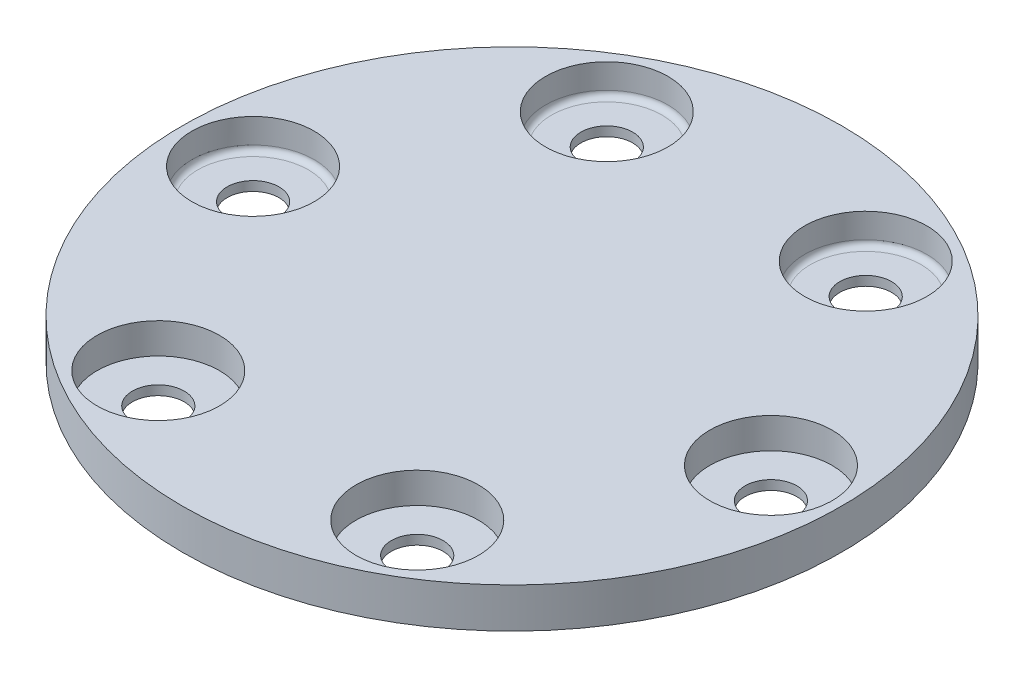
ISO-10303-21;
HEADER;
FILE_DESCRIPTION(('STEP AP214'),'2;1');
FILE_NAME('part.step','',(''),(''),'','','');
FILE_SCHEMA(('AUTOMOTIVE_DESIGN { 1 0 10303 214 1 1 1 1 }'));
ENDSEC;
DATA;
#1=APPLICATION_CONTEXT('core data for automotive mechanical design processes');
#2=APPLICATION_PROTOCOL_DEFINITION('international standard','automotive_design',2000,#1);
#3=PRODUCT_CONTEXT('',#1,'mechanical');
#4=PRODUCT('Part','Part','',(#3));
#5=PRODUCT_RELATED_PRODUCT_CATEGORY('part','',(#4));
#6=PRODUCT_DEFINITION_FORMATION('','',#4);
#7=PRODUCT_DEFINITION_CONTEXT('part definition',#1,'design');
#8=PRODUCT_DEFINITION('design','',#6,#7);
#9=PRODUCT_DEFINITION_SHAPE('','',#8);
#10=(LENGTH_UNIT() NAMED_UNIT(*) SI_UNIT(.MILLI.,.METRE.));
#11=(NAMED_UNIT(*) PLANE_ANGLE_UNIT() SI_UNIT($,.RADIAN.));
#12=(NAMED_UNIT(*) SI_UNIT($,.STERADIAN.) SOLID_ANGLE_UNIT());
#13=UNCERTAINTY_MEASURE_WITH_UNIT(LENGTH_MEASURE(1.E-05),#10,'distance_accuracy_value','');
#14=(GEOMETRIC_REPRESENTATION_CONTEXT(3) GLOBAL_UNCERTAINTY_ASSIGNED_CONTEXT((#13)) GLOBAL_UNIT_ASSIGNED_CONTEXT((#10,
#11,#12)) REPRESENTATION_CONTEXT('',''));
#15=CARTESIAN_POINT('',(0.,0.,0.));
#16=DIRECTION('',(0.,0.,1.));
#17=DIRECTION('',(1.,0.,0.));
#18=AXIS2_PLACEMENT_3D('',#15,#16,#17);
#19=CARTESIAN_POINT('',(0.,1.7,0.));
#20=DIRECTION('',(0.,-1.,0.));
#21=DIRECTION('',(0.,0.,-1.));
#22=AXIS2_PLACEMENT_3D('',#19,#20,#21);
#23=CYLINDRICAL_SURFACE('',#22,14.);
#24=CARTESIAN_POINT('',(0.,1.7,0.));
#25=DIRECTION('',(0.,1.,0.));
#26=DIRECTION('',(0.,0.,1.));
#27=AXIS2_PLACEMENT_3D('',#24,#25,#26);
#28=CIRCLE('',#27,14.);
#29=CARTESIAN_POINT('',(0.,1.7,14.));
#30=VERTEX_POINT('',#29);
#31=EDGE_CURVE('E59',#30,#30,#28,.T.);
#32=ORIENTED_EDGE('',*,*,#31,.F.);
#33=EDGE_LOOP('',(#32));
#34=FACE_BOUND('',#33,.T.);
#35=CARTESIAN_POINT('',(0.,0.,0.));
#36=DIRECTION('',(0.,1.,0.));
#37=DIRECTION('',(0.,0.,1.));
#38=AXIS2_PLACEMENT_3D('',#35,#36,#37);
#39=CIRCLE('',#38,14.);
#40=CARTESIAN_POINT('',(0.,0.,14.));
#41=VERTEX_POINT('',#40);
#42=EDGE_CURVE('E63',#41,#41,#39,.T.);
#43=ORIENTED_EDGE('',*,*,#42,.T.);
#44=EDGE_LOOP('',(#43));
#45=FACE_BOUND('',#44,.T.);
#46=ADVANCED_FACE('F33',(#34,#45),#23,.T.);
#47=CARTESIAN_POINT('',(0.,1.7,0.));
#48=DIRECTION('',(0.,1.,0.));
#49=DIRECTION('',(0.,0.,1.));
#50=AXIS2_PLACEMENT_3D('',#47,#48,#49);
#51=PLANE('',#50);
#52=CARTESIAN_POINT('',(-5.50000000000011,1.7,-9.52627944162876));
#53=DIRECTION('',(0.,1.,0.));
#54=DIRECTION('',(-0.866025403784433,0.,0.50000000000001));
#55=AXIS2_PLACEMENT_3D('',#52,#53,#54);
#56=CIRCLE('',#55,2.6);
#57=CARTESIAN_POINT('',(-7.75166604983964,1.7,-8.22627944162873));
#58=VERTEX_POINT('',#57);
#59=EDGE_CURVE('E94',#58,#58,#56,.T.);
#60=ORIENTED_EDGE('',*,*,#59,.F.);
#61=EDGE_LOOP('',(#60));
#62=FACE_BOUND('',#61,.T.);
#63=CARTESIAN_POINT('',(5.49999999999991,1.7,-9.52627944162887));
#64=DIRECTION('',(0.,1.,0.));
#65=DIRECTION('',(-0.866025403784443,0.,-0.499999999999992));
#66=AXIS2_PLACEMENT_3D('',#63,#64,#65);
#67=CIRCLE('',#66,2.6);
#68=CARTESIAN_POINT('',(3.24833395016036,1.7,-10.8262794416289));
#69=VERTEX_POINT('',#68);
#70=EDGE_CURVE('E90',#69,#69,#67,.T.);
#71=ORIENTED_EDGE('',*,*,#70,.F.);
#72=EDGE_LOOP('',(#71));
#73=FACE_BOUND('',#72,.T.);
#74=CARTESIAN_POINT('',(11.,1.7,0.));
#75=DIRECTION('',(0.,1.,0.));
#76=DIRECTION('',(0.,0.,-1.));
#77=AXIS2_PLACEMENT_3D('',#74,#75,#76);
#78=CIRCLE('',#77,2.6);
#79=CARTESIAN_POINT('',(11.,1.7,-2.6));
#80=VERTEX_POINT('',#79);
#81=EDGE_CURVE('E100',#80,#80,#78,.T.);
#82=ORIENTED_EDGE('',*,*,#81,.F.);
#83=EDGE_LOOP('',(#82));
#84=FACE_BOUND('',#83,.T.);
#85=CARTESIAN_POINT('',(5.50000000000004,1.7,9.5262794416288));
#86=DIRECTION('',(0.,1.,0.));
#87=DIRECTION('',(0.866025403784436,0.,-0.500000000000004));
#88=AXIS2_PLACEMENT_3D('',#85,#86,#87);
#89=CIRCLE('',#88,2.6);
#90=CARTESIAN_POINT('',(7.75166604983958,1.7,8.22627944162879));
#91=VERTEX_POINT('',#90);
#92=EDGE_CURVE('E109',#91,#91,#89,.T.);
#93=ORIENTED_EDGE('',*,*,#92,.F.);
#94=EDGE_LOOP('',(#93));
#95=FACE_BOUND('',#94,.T.);
#96=CARTESIAN_POINT('',(-5.49999999999998,1.7,9.52627944162884));
#97=DIRECTION('',(0.,1.,0.));
#98=DIRECTION('',(0.86602540378444,0.,0.499999999999998));
#99=AXIS2_PLACEMENT_3D('',#96,#97,#98);
#100=CIRCLE('',#99,2.6);
#101=CARTESIAN_POINT('',(-3.24833395016043,1.7,10.8262794416288));
#102=VERTEX_POINT('',#101);
#103=EDGE_CURVE('E83',#102,#102,#100,.T.);
#104=ORIENTED_EDGE('',*,*,#103,.F.);
#105=EDGE_LOOP('',(#104));
#106=FACE_BOUND('',#105,.T.);
#107=CARTESIAN_POINT('',(-11.,1.7,0.));
#108=DIRECTION('',(0.,1.,0.));
#109=DIRECTION('',(0.,0.,1.));
#110=AXIS2_PLACEMENT_3D('',#107,#108,#109);
#111=CIRCLE('',#110,2.6);
#112=CARTESIAN_POINT('',(-11.,1.7,2.6));
#113=VERTEX_POINT('',#112);
#114=EDGE_CURVE('E71',#113,#113,#111,.T.);
#115=ORIENTED_EDGE('',*,*,#114,.F.);
#116=EDGE_LOOP('',(#115));
#117=FACE_BOUND('',#116,.T.);
#118=ORIENTED_EDGE('',*,*,#31,.T.);
#119=EDGE_LOOP('',(#118));
#120=FACE_BOUND('',#119,.T.);
#121=ADVANCED_FACE('F131',(#62,#73,#84,#95,#106,#117,#120),#51,.T.);
#122=CARTESIAN_POINT('',(0.,0.,0.));
#123=DIRECTION('',(0.,1.,0.));
#124=DIRECTION('',(0.,0.,1.));
#125=AXIS2_PLACEMENT_3D('',#122,#123,#124);
#126=PLANE('',#125);
#127=CARTESIAN_POINT('',(-5.50000000000011,0.,-9.52627944162876));
#128=DIRECTION('',(0.,1.,0.));
#129=DIRECTION('',(-0.866025403784433,0.,0.50000000000001));
#130=AXIS2_PLACEMENT_3D('',#127,#128,#129);
#131=CIRCLE('',#130,1.1);
#132=CARTESIAN_POINT('',(-6.45262794416299,0.,-8.97627944162875));
#133=VERTEX_POINT('',#132);
#134=EDGE_CURVE('E91',#133,#133,#131,.T.);
#135=ORIENTED_EDGE('',*,*,#134,.T.);
#136=EDGE_LOOP('',(#135));
#137=FACE_BOUND('',#136,.T.);
#138=CARTESIAN_POINT('',(5.49999999999991,0.,-9.52627944162887));
#139=DIRECTION('',(0.,1.,0.));
#140=DIRECTION('',(-0.866025403784443,0.,-0.499999999999992));
#141=AXIS2_PLACEMENT_3D('',#138,#139,#140);
#142=CIRCLE('',#141,1.1);
#143=CARTESIAN_POINT('',(4.54737205583702,0.,-10.0762794416289));
#144=VERTEX_POINT('',#143);
#145=EDGE_CURVE('E101',#144,#144,#142,.T.);
#146=ORIENTED_EDGE('',*,*,#145,.T.);
#147=EDGE_LOOP('',(#146));
#148=FACE_BOUND('',#147,.T.);
#149=CARTESIAN_POINT('',(11.,0.,0.));
#150=DIRECTION('',(0.,1.,0.));
#151=DIRECTION('',(0.,0.,-1.));
#152=AXIS2_PLACEMENT_3D('',#149,#150,#151);
#153=CIRCLE('',#152,1.1);
#154=CARTESIAN_POINT('',(11.,0.,-1.1));
#155=VERTEX_POINT('',#154);
#156=EDGE_CURVE('E113',#155,#155,#153,.T.);
#157=ORIENTED_EDGE('',*,*,#156,.T.);
#158=EDGE_LOOP('',(#157));
#159=FACE_BOUND('',#158,.T.);
#160=CARTESIAN_POINT('',(5.50000000000004,0.,9.5262794416288));
#161=DIRECTION('',(0.,1.,0.));
#162=DIRECTION('',(0.866025403784436,0.,-0.500000000000004));
#163=AXIS2_PLACEMENT_3D('',#160,#161,#162);
#164=CIRCLE('',#163,1.1);
#165=CARTESIAN_POINT('',(6.45262794416292,0.,8.9762794416288));
#166=VERTEX_POINT('',#165);
#167=EDGE_CURVE('E123',#166,#166,#164,.T.);
#168=ORIENTED_EDGE('',*,*,#167,.T.);
#169=EDGE_LOOP('',(#168));
#170=FACE_BOUND('',#169,.T.);
#171=CARTESIAN_POINT('',(-5.49999999999998,0.,9.52627944162884));
#172=DIRECTION('',(0.,1.,0.));
#173=DIRECTION('',(0.86602540378444,0.,0.499999999999998));
#174=AXIS2_PLACEMENT_3D('',#171,#172,#173);
#175=CIRCLE('',#174,1.1);
#176=CARTESIAN_POINT('',(-4.5473720558371,0.,10.0762794416288));
#177=VERTEX_POINT('',#176);
#178=EDGE_CURVE('E80',#177,#177,#175,.T.);
#179=ORIENTED_EDGE('',*,*,#178,.T.);
#180=EDGE_LOOP('',(#179));
#181=FACE_BOUND('',#180,.T.);
#182=CARTESIAN_POINT('',(-11.,0.,0.));
#183=DIRECTION('',(0.,1.,0.));
#184=DIRECTION('',(0.,0.,1.));
#185=AXIS2_PLACEMENT_3D('',#182,#183,#184);
#186=CIRCLE('',#185,1.1);
#187=CARTESIAN_POINT('',(-11.,0.,1.1));
#188=VERTEX_POINT('',#187);
#189=EDGE_CURVE('E60',#188,#188,#186,.T.);
#190=ORIENTED_EDGE('',*,*,#189,.T.);
#191=EDGE_LOOP('',(#190));
#192=FACE_BOUND('',#191,.T.);
#193=ORIENTED_EDGE('',*,*,#42,.F.);
#194=EDGE_LOOP('',(#193));
#195=FACE_BOUND('',#194,.T.);
#196=ADVANCED_FACE('F134',(#137,#148,#159,#170,#181,#192,#195),#126,.F.);
#197=CARTESIAN_POINT('',(-11.,1.7,0.));
#198=DIRECTION('',(0.,1.,0.));
#199=DIRECTION('',(0.,0.,1.));
#200=AXIS2_PLACEMENT_3D('',#197,#198,#199);
#201=CYLINDRICAL_SURFACE('',#200,1.1);
#202=CARTESIAN_POINT('',(-11.,0.4,0.));
#203=DIRECTION('',(0.,1.,0.));
#204=DIRECTION('',(0.,0.,1.));
#205=AXIS2_PLACEMENT_3D('',#202,#203,#204);
#206=CIRCLE('',#205,1.1);
#207=CARTESIAN_POINT('',(-11.,0.4,1.1));
#208=VERTEX_POINT('',#207);
#209=EDGE_CURVE('E64',#208,#208,#206,.T.);
#210=ORIENTED_EDGE('',*,*,#209,.T.);
#211=EDGE_LOOP('',(#210));
#212=FACE_BOUND('',#211,.T.);
#213=ORIENTED_EDGE('',*,*,#189,.F.);
#214=EDGE_LOOP('',(#213));
#215=FACE_BOUND('',#214,.T.);
#216=ADVANCED_FACE('F149',(#212,#215),#201,.F.);
#217=CARTESIAN_POINT('',(-9.9,0.4,0.));
#218=DIRECTION('',(0.,-1.,0.));
#219=DIRECTION('',(0.,0.,-1.));
#220=AXIS2_PLACEMENT_3D('',#217,#218,#219);
#221=PLANE('',#220);
#222=CARTESIAN_POINT('',(-11.,0.4,0.));
#223=DIRECTION('',(0.,-1.,0.));
#224=DIRECTION('',(0.,0.,-1.));
#225=AXIS2_PLACEMENT_3D('',#222,#223,#224);
#226=CIRCLE('',#225,2.35);
#227=CARTESIAN_POINT('',(-11.,0.4,-2.35));
#228=VERTEX_POINT('',#227);
#229=EDGE_CURVE('E56',#228,#228,#226,.F.);
#230=ORIENTED_EDGE('',*,*,#229,.T.);
#231=EDGE_LOOP('',(#230));
#232=FACE_BOUND('',#231,.T.);
#233=ORIENTED_EDGE('',*,*,#209,.F.);
#234=EDGE_LOOP('',(#233));
#235=FACE_BOUND('',#234,.T.);
#236=ADVANCED_FACE('F155',(#232,#235),#221,.F.);
#237=CARTESIAN_POINT('',(-11.,1.7,0.));
#238=DIRECTION('',(0.,1.,0.));
#239=DIRECTION('',(0.,0.,1.));
#240=AXIS2_PLACEMENT_3D('',#237,#238,#239);
#241=CYLINDRICAL_SURFACE('',#240,2.6);
#242=CARTESIAN_POINT('',(-11.,0.65,0.));
#243=DIRECTION('',(0.,-1.,0.));
#244=DIRECTION('',(0.,0.,-1.));
#245=AXIS2_PLACEMENT_3D('',#242,#243,#244);
#246=CIRCLE('',#245,2.6);
#247=CARTESIAN_POINT('',(-11.,0.65,-2.6));
#248=VERTEX_POINT('',#247);
#249=EDGE_CURVE('E53',#248,#248,#246,.T.);
#250=ORIENTED_EDGE('',*,*,#249,.T.);
#251=EDGE_LOOP('',(#250));
#252=FACE_BOUND('',#251,.T.);
#253=ORIENTED_EDGE('',*,*,#114,.T.);
#254=EDGE_LOOP('',(#253));
#255=FACE_BOUND('',#254,.T.);
#256=ADVANCED_FACE('F201',(#252,#255),#241,.F.);
#257=CARTESIAN_POINT('',(-5.49999999999998,1.7,9.52627944162884));
#258=DIRECTION('',(0.,1.,0.));
#259=DIRECTION('',(0.86602540378444,0.,0.499999999999998));
#260=AXIS2_PLACEMENT_3D('',#257,#258,#259);
#261=CYLINDRICAL_SURFACE('',#260,1.1);
#262=CARTESIAN_POINT('',(-5.49999999999998,0.4,9.52627944162884));
#263=DIRECTION('',(0.,1.,0.));
#264=DIRECTION('',(0.86602540378444,0.,0.499999999999998));
#265=AXIS2_PLACEMENT_3D('',#262,#263,#264);
#266=CIRCLE('',#265,1.1);
#267=CARTESIAN_POINT('',(-4.5473720558371,0.4,10.0762794416288));
#268=VERTEX_POINT('',#267);
#269=EDGE_CURVE('E74',#268,#268,#266,.T.);
#270=ORIENTED_EDGE('',*,*,#269,.T.);
#271=EDGE_LOOP('',(#270));
#272=FACE_BOUND('',#271,.T.);
#273=ORIENTED_EDGE('',*,*,#178,.F.);
#274=EDGE_LOOP('',(#273));
#275=FACE_BOUND('',#274,.T.);
#276=ADVANCED_FACE('F198',(#272,#275),#261,.F.);
#277=CARTESIAN_POINT('',(-4.94999999999998,0.4,8.57365149746595));
#278=DIRECTION('',(0.,-1.,0.));
#279=DIRECTION('',(-0.86602540378444,0.,-0.499999999999998));
#280=AXIS2_PLACEMENT_3D('',#277,#278,#279);
#281=PLANE('',#280);
#282=ORIENTED_EDGE('',*,*,#269,.F.);
#283=EDGE_LOOP('',(#282));
#284=FACE_BOUND('',#283,.T.);
#285=CARTESIAN_POINT('',(-5.49999999999998,0.4,9.52627944162884));
#286=DIRECTION('',(0.,1.,0.));
#287=DIRECTION('',(0.86602540378444,0.,0.499999999999998));
#288=AXIS2_PLACEMENT_3D('',#285,#286,#287);
#289=CIRCLE('',#288,2.6);
#290=CARTESIAN_POINT('',(-3.24833395016043,0.4,10.8262794416288));
#291=VERTEX_POINT('',#290);
#292=EDGE_CURVE('E77',#291,#291,#289,.T.);
#293=ORIENTED_EDGE('',*,*,#292,.T.);
#294=EDGE_LOOP('',(#293));
#295=FACE_BOUND('',#294,.T.);
#296=ADVANCED_FACE('F200',(#284,#295),#281,.F.);
#297=CARTESIAN_POINT('',(-5.49999999999998,1.7,9.52627944162884));
#298=DIRECTION('',(0.,1.,0.));
#299=DIRECTION('',(0.86602540378444,0.,0.499999999999998));
#300=AXIS2_PLACEMENT_3D('',#297,#298,#299);
#301=CYLINDRICAL_SURFACE('',#300,2.6);
#302=ORIENTED_EDGE('',*,*,#292,.F.);
#303=EDGE_LOOP('',(#302));
#304=FACE_BOUND('',#303,.T.);
#305=ORIENTED_EDGE('',*,*,#103,.T.);
#306=EDGE_LOOP('',(#305));
#307=FACE_BOUND('',#306,.T.);
#308=ADVANCED_FACE('F208',(#304,#307),#301,.F.);
#309=CARTESIAN_POINT('',(5.50000000000004,1.7,9.5262794416288));
#310=DIRECTION('',(0.,1.,0.));
#311=DIRECTION('',(0.866025403784436,0.,-0.500000000000004));
#312=AXIS2_PLACEMENT_3D('',#309,#310,#311);
#313=CYLINDRICAL_SURFACE('',#312,1.1);
#314=CARTESIAN_POINT('',(5.50000000000004,0.4,9.5262794416288));
#315=DIRECTION('',(0.,1.,0.));
#316=DIRECTION('',(0.866025403784436,0.,-0.500000000000004));
#317=AXIS2_PLACEMENT_3D('',#314,#315,#316);
#318=CIRCLE('',#317,1.1);
#319=CARTESIAN_POINT('',(6.45262794416292,0.4,8.9762794416288));
#320=VERTEX_POINT('',#319);
#321=EDGE_CURVE('E86',#320,#320,#318,.T.);
#322=ORIENTED_EDGE('',*,*,#321,.T.);
#323=EDGE_LOOP('',(#322));
#324=FACE_BOUND('',#323,.T.);
#325=ORIENTED_EDGE('',*,*,#167,.F.);
#326=EDGE_LOOP('',(#325));
#327=FACE_BOUND('',#326,.T.);
#328=ADVANCED_FACE('F332',(#324,#327),#313,.F.);
#329=CARTESIAN_POINT('',(4.95000000000004,0.4,8.57365149746592));
#330=DIRECTION('',(0.,-1.,0.));
#331=DIRECTION('',(-0.866025403784436,0.,0.500000000000004));
#332=AXIS2_PLACEMENT_3D('',#329,#330,#331);
#333=PLANE('',#332);
#334=ORIENTED_EDGE('',*,*,#321,.F.);
#335=EDGE_LOOP('',(#334));
#336=FACE_BOUND('',#335,.T.);
#337=CARTESIAN_POINT('',(5.50000000000004,0.4,9.5262794416288));
#338=DIRECTION('',(0.,1.,0.));
#339=DIRECTION('',(0.866025403784436,0.,-0.500000000000004));
#340=AXIS2_PLACEMENT_3D('',#337,#338,#339);
#341=CIRCLE('',#340,2.6);
#342=CARTESIAN_POINT('',(7.75166604983958,0.4,8.22627944162879));
#343=VERTEX_POINT('',#342);
#344=EDGE_CURVE('E120',#343,#343,#341,.T.);
#345=ORIENTED_EDGE('',*,*,#344,.T.);
#346=EDGE_LOOP('',(#345));
#347=FACE_BOUND('',#346,.T.);
#348=ADVANCED_FACE('F323',(#336,#347),#333,.F.);
#349=CARTESIAN_POINT('',(5.50000000000004,1.7,9.5262794416288));
#350=DIRECTION('',(0.,1.,0.));
#351=DIRECTION('',(0.866025403784436,0.,-0.500000000000004));
#352=AXIS2_PLACEMENT_3D('',#349,#350,#351);
#353=CYLINDRICAL_SURFACE('',#352,2.6);
#354=ORIENTED_EDGE('',*,*,#344,.F.);
#355=EDGE_LOOP('',(#354));
#356=FACE_BOUND('',#355,.T.);
#357=ORIENTED_EDGE('',*,*,#92,.T.);
#358=EDGE_LOOP('',(#357));
#359=FACE_BOUND('',#358,.T.);
#360=ADVANCED_FACE('F129',(#356,#359),#353,.F.);
#361=CARTESIAN_POINT('',(11.,1.7,0.));
#362=DIRECTION('',(0.,1.,0.));
#363=DIRECTION('',(0.,0.,-1.));
#364=AXIS2_PLACEMENT_3D('',#361,#362,#363);
#365=CYLINDRICAL_SURFACE('',#364,1.1);
#366=CARTESIAN_POINT('',(11.,0.4,0.));
#367=DIRECTION('',(0.,1.,0.));
#368=DIRECTION('',(0.,0.,-1.));
#369=AXIS2_PLACEMENT_3D('',#366,#367,#368);
#370=CIRCLE('',#369,1.1);
#371=CARTESIAN_POINT('',(11.,0.4,-1.1));
#372=VERTEX_POINT('',#371);
#373=EDGE_CURVE('E106',#372,#372,#370,.T.);
#374=ORIENTED_EDGE('',*,*,#373,.T.);
#375=EDGE_LOOP('',(#374));
#376=FACE_BOUND('',#375,.T.);
#377=ORIENTED_EDGE('',*,*,#156,.F.);
#378=EDGE_LOOP('',(#377));
#379=FACE_BOUND('',#378,.T.);
#380=ADVANCED_FACE('F306',(#376,#379),#365,.F.);
#381=CARTESIAN_POINT('',(9.9,0.4,0.));
#382=DIRECTION('',(0.,-1.,0.));
#383=DIRECTION('',(0.,0.,1.));
#384=AXIS2_PLACEMENT_3D('',#381,#382,#383);
#385=PLANE('',#384);
#386=ORIENTED_EDGE('',*,*,#373,.F.);
#387=EDGE_LOOP('',(#386));
#388=FACE_BOUND('',#387,.T.);
#389=CARTESIAN_POINT('',(11.,0.4,0.));
#390=DIRECTION('',(0.,1.,0.));
#391=DIRECTION('',(0.,0.,-1.));
#392=AXIS2_PLACEMENT_3D('',#389,#390,#391);
#393=CIRCLE('',#392,2.6);
#394=CARTESIAN_POINT('',(11.,0.4,-2.6));
#395=VERTEX_POINT('',#394);
#396=EDGE_CURVE('E110',#395,#395,#393,.T.);
#397=ORIENTED_EDGE('',*,*,#396,.T.);
#398=EDGE_LOOP('',(#397));
#399=FACE_BOUND('',#398,.T.);
#400=ADVANCED_FACE('F297',(#388,#399),#385,.F.);
#401=CARTESIAN_POINT('',(11.,1.7,0.));
#402=DIRECTION('',(0.,1.,0.));
#403=DIRECTION('',(0.,0.,-1.));
#404=AXIS2_PLACEMENT_3D('',#401,#402,#403);
#405=CYLINDRICAL_SURFACE('',#404,2.6);
#406=ORIENTED_EDGE('',*,*,#396,.F.);
#407=EDGE_LOOP('',(#406));
#408=FACE_BOUND('',#407,.T.);
#409=ORIENTED_EDGE('',*,*,#81,.T.);
#410=EDGE_LOOP('',(#409));
#411=FACE_BOUND('',#410,.T.);
#412=ADVANCED_FACE('F185',(#408,#411),#405,.F.);
#413=CARTESIAN_POINT('',(5.49999999999991,1.7,-9.52627944162887));
#414=DIRECTION('',(0.,1.,0.));
#415=DIRECTION('',(-0.866025403784443,0.,-0.499999999999992));
#416=AXIS2_PLACEMENT_3D('',#413,#414,#415);
#417=CYLINDRICAL_SURFACE('',#416,1.1);
#418=CARTESIAN_POINT('',(5.49999999999991,0.4,-9.52627944162887));
#419=DIRECTION('',(0.,1.,0.));
#420=DIRECTION('',(-0.866025403784443,0.,-0.499999999999992));
#421=AXIS2_PLACEMENT_3D('',#418,#419,#420);
#422=CIRCLE('',#421,1.1);
#423=CARTESIAN_POINT('',(4.54737205583702,0.4,-10.0762794416289));
#424=VERTEX_POINT('',#423);
#425=EDGE_CURVE('E97',#424,#424,#422,.T.);
#426=ORIENTED_EDGE('',*,*,#425,.T.);
#427=EDGE_LOOP('',(#426));
#428=FACE_BOUND('',#427,.T.);
#429=ORIENTED_EDGE('',*,*,#145,.F.);
#430=EDGE_LOOP('',(#429));
#431=FACE_BOUND('',#430,.T.);
#432=ADVANCED_FACE('F179',(#428,#431),#417,.F.);
#433=CARTESIAN_POINT('',(4.94999999999992,0.4,-8.57365149746599));
#434=DIRECTION('',(0.,-1.,0.));
#435=DIRECTION('',(0.866025403784443,0.,0.499999999999992));
#436=AXIS2_PLACEMENT_3D('',#433,#434,#435);
#437=PLANE('',#436);
#438=CARTESIAN_POINT('',(5.49999999999991,0.4,-9.52627944162887));
#439=DIRECTION('',(0.,-1.,0.));
#440=DIRECTION('',(0.,0.,-1.));
#441=AXIS2_PLACEMENT_3D('',#438,#439,#440);
#442=CIRCLE('',#441,2.35);
#443=CARTESIAN_POINT('',(5.49999999999991,0.4,-11.8762794416289));
#444=VERTEX_POINT('',#443);
#445=EDGE_CURVE('E48',#444,#444,#442,.F.);
#446=ORIENTED_EDGE('',*,*,#445,.T.);
#447=EDGE_LOOP('',(#446));
#448=FACE_BOUND('',#447,.T.);
#449=ORIENTED_EDGE('',*,*,#425,.F.);
#450=EDGE_LOOP('',(#449));
#451=FACE_BOUND('',#450,.T.);
#452=ADVANCED_FACE('F175',(#448,#451),#437,.F.);
#453=CARTESIAN_POINT('',(5.49999999999991,1.7,-9.52627944162887));
#454=DIRECTION('',(0.,1.,0.));
#455=DIRECTION('',(-0.866025403784443,0.,-0.499999999999992));
#456=AXIS2_PLACEMENT_3D('',#453,#454,#455);
#457=CYLINDRICAL_SURFACE('',#456,2.6);
#458=CARTESIAN_POINT('',(5.49999999999991,0.65,-9.52627944162887));
#459=DIRECTION('',(0.,-1.,0.));
#460=DIRECTION('',(0.,0.,-1.));
#461=AXIS2_PLACEMENT_3D('',#458,#459,#460);
#462=CIRCLE('',#461,2.6);
#463=CARTESIAN_POINT('',(5.49999999999991,0.65,-12.1262794416289));
#464=VERTEX_POINT('',#463);
#465=EDGE_CURVE('E44',#464,#464,#462,.T.);
#466=ORIENTED_EDGE('',*,*,#465,.T.);
#467=EDGE_LOOP('',(#466));
#468=FACE_BOUND('',#467,.T.);
#469=ORIENTED_EDGE('',*,*,#70,.T.);
#470=EDGE_LOOP('',(#469));
#471=FACE_BOUND('',#470,.T.);
#472=ADVANCED_FACE('F178',(#468,#471),#457,.F.);
#473=CARTESIAN_POINT('',(-5.50000000000011,1.7,-9.52627944162876));
#474=DIRECTION('',(0.,1.,0.));
#475=DIRECTION('',(-0.866025403784433,0.,0.50000000000001));
#476=AXIS2_PLACEMENT_3D('',#473,#474,#475);
#477=CYLINDRICAL_SURFACE('',#476,1.1);
#478=CARTESIAN_POINT('',(-5.50000000000011,0.4,-9.52627944162876));
#479=DIRECTION('',(0.,1.,0.));
#480=DIRECTION('',(-0.866025403784433,0.,0.50000000000001));
#481=AXIS2_PLACEMENT_3D('',#478,#479,#480);
#482=CIRCLE('',#481,1.1);
#483=CARTESIAN_POINT('',(-6.45262794416299,0.4,-8.97627944162875));
#484=VERTEX_POINT('',#483);
#485=EDGE_CURVE('E87',#484,#484,#482,.T.);
#486=ORIENTED_EDGE('',*,*,#485,.T.);
#487=EDGE_LOOP('',(#486));
#488=FACE_BOUND('',#487,.T.);
#489=ORIENTED_EDGE('',*,*,#134,.F.);
#490=EDGE_LOOP('',(#489));
#491=FACE_BOUND('',#490,.T.);
#492=ADVANCED_FACE('F227',(#488,#491),#477,.F.);
#493=CARTESIAN_POINT('',(-4.9500000000001,0.4,-8.57365149746589));
#494=DIRECTION('',(0.,-1.,0.));
#495=DIRECTION('',(0.866025403784433,0.,-0.50000000000001));
#496=AXIS2_PLACEMENT_3D('',#493,#494,#495);
#497=PLANE('',#496);
#498=CARTESIAN_POINT('',(-5.50000000000011,0.4,-9.52627944162876));
#499=DIRECTION('',(0.,-1.,0.));
#500=DIRECTION('',(0.,0.,-1.));
#501=AXIS2_PLACEMENT_3D('',#498,#499,#500);
#502=CIRCLE('',#501,2.35);
#503=CARTESIAN_POINT('',(-5.50000000000011,0.4,-11.8762794416288));
#504=VERTEX_POINT('',#503);
#505=EDGE_CURVE('E40',#504,#504,#502,.F.);
#506=ORIENTED_EDGE('',*,*,#505,.T.);
#507=EDGE_LOOP('',(#506));
#508=FACE_BOUND('',#507,.T.);
#509=ORIENTED_EDGE('',*,*,#485,.F.);
#510=EDGE_LOOP('',(#509));
#511=FACE_BOUND('',#510,.T.);
#512=ADVANCED_FACE('F247',(#508,#511),#497,.F.);
#513=CARTESIAN_POINT('',(-5.50000000000011,1.7,-9.52627944162876));
#514=DIRECTION('',(0.,1.,0.));
#515=DIRECTION('',(-0.866025403784433,0.,0.50000000000001));
#516=AXIS2_PLACEMENT_3D('',#513,#514,#515);
#517=CYLINDRICAL_SURFACE('',#516,2.6);
#518=CARTESIAN_POINT('',(-5.50000000000011,0.65,-9.52627944162876));
#519=DIRECTION('',(0.,-1.,0.));
#520=DIRECTION('',(0.,0.,-1.));
#521=AXIS2_PLACEMENT_3D('',#518,#519,#520);
#522=CIRCLE('',#521,2.6);
#523=CARTESIAN_POINT('',(-5.50000000000011,0.65,-12.1262794416288));
#524=VERTEX_POINT('',#523);
#525=EDGE_CURVE('E10',#524,#524,#522,.T.);
#526=ORIENTED_EDGE('',*,*,#525,.T.);
#527=EDGE_LOOP('',(#526));
#528=FACE_BOUND('',#527,.T.);
#529=ORIENTED_EDGE('',*,*,#59,.T.);
#530=EDGE_LOOP('',(#529));
#531=FACE_BOUND('',#530,.T.);
#532=ADVANCED_FACE('F163',(#528,#531),#517,.F.);
#533=CARTESIAN_POINT('',(-11.,0.65,0.));
#534=DIRECTION('',(0.,-1.,0.));
#535=DIRECTION('',(0.,0.,-1.));
#536=AXIS2_PLACEMENT_3D('',#533,#534,#535);
#537=TOROIDAL_SURFACE('',#536,2.35,0.25);
#538=ORIENTED_EDGE('',*,*,#249,.F.);
#539=EDGE_LOOP('',(#538));
#540=FACE_BOUND('',#539,.T.);
#541=ORIENTED_EDGE('',*,*,#229,.F.);
#542=EDGE_LOOP('',(#541));
#543=FACE_BOUND('',#542,.T.);
#544=ADVANCED_FACE('F160',(#540,#543),#537,.F.);
#545=CARTESIAN_POINT('',(5.49999999999991,0.65,-9.52627944162887));
#546=DIRECTION('',(0.,-1.,0.));
#547=DIRECTION('',(0.,0.,-1.));
#548=AXIS2_PLACEMENT_3D('',#545,#546,#547);
#549=TOROIDAL_SURFACE('',#548,2.35,0.25);
#550=ORIENTED_EDGE('',*,*,#465,.F.);
#551=EDGE_LOOP('',(#550));
#552=FACE_BOUND('',#551,.T.);
#553=ORIENTED_EDGE('',*,*,#445,.F.);
#554=EDGE_LOOP('',(#553));
#555=FACE_BOUND('',#554,.T.);
#556=ADVANCED_FACE('F162',(#552,#555),#549,.F.);
#557=CARTESIAN_POINT('',(-5.50000000000011,0.65,-9.52627944162876));
#558=DIRECTION('',(0.,-1.,0.));
#559=DIRECTION('',(0.,0.,-1.));
#560=AXIS2_PLACEMENT_3D('',#557,#558,#559);
#561=TOROIDAL_SURFACE('',#560,2.35,0.25);
#562=ORIENTED_EDGE('',*,*,#525,.F.);
#563=EDGE_LOOP('',(#562));
#564=FACE_BOUND('',#563,.T.);
#565=ORIENTED_EDGE('',*,*,#505,.F.);
#566=EDGE_LOOP('',(#565));
#567=FACE_BOUND('',#566,.T.);
#568=ADVANCED_FACE('F35',(#564,#567),#561,.F.);
#569=CLOSED_SHELL('',(#46,#121,#196,#216,#236,#256,#276,#296,#308,#328,#348,#360,#380,#400,#412,
#432,#452,#472,#492,#512,#532,#544,#556,#568));
#570=MANIFOLD_SOLID_BREP('B2',#569);
#571=ADVANCED_BREP_SHAPE_REPRESENTATION('',(#18,#570),#14);
#572=SHAPE_DEFINITION_REPRESENTATION(#9,#571);
ENDSEC;
END-ISO-10303-21;
